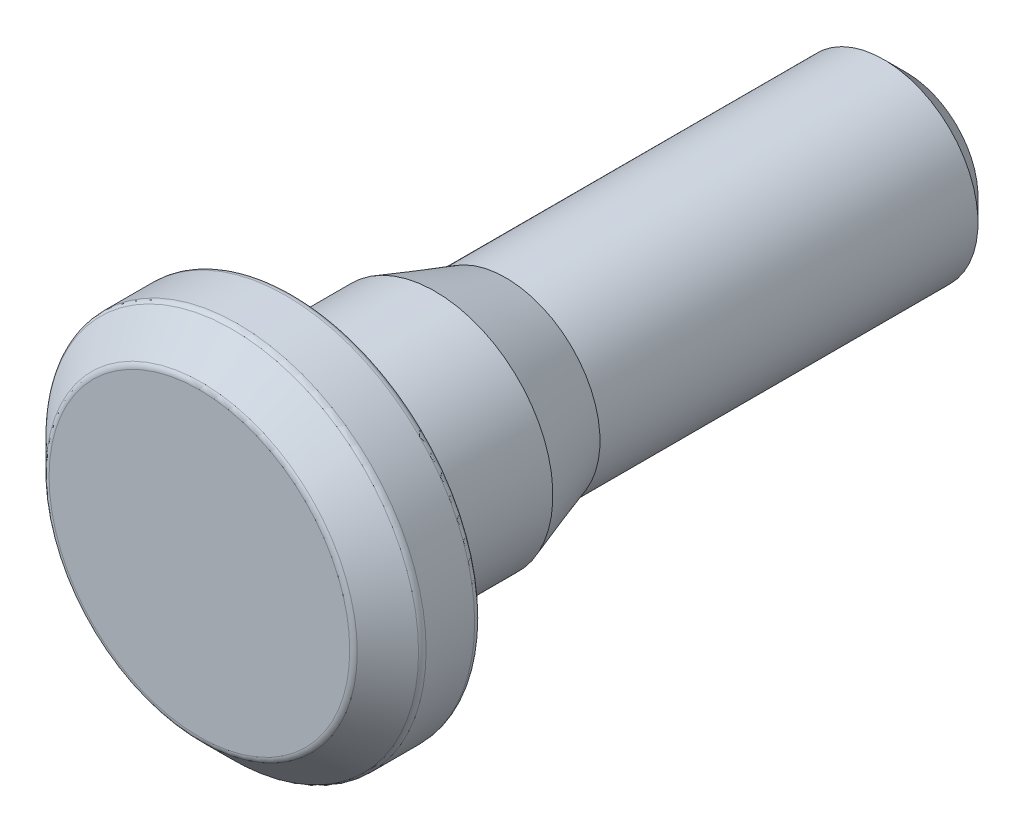
ISO-10303-21;
HEADER;
FILE_DESCRIPTION(('STEP AP214'),'2;1');
FILE_NAME('part.step','',(''),(''),'','','');
FILE_SCHEMA(('AUTOMOTIVE_DESIGN { 1 0 10303 214 1 1 1 1 }'));
ENDSEC;
DATA;
#1=APPLICATION_CONTEXT('core data for automotive mechanical design processes');
#2=APPLICATION_PROTOCOL_DEFINITION('international standard','automotive_design',2000,#1);
#3=PRODUCT_CONTEXT('',#1,'mechanical');
#4=PRODUCT('Part','Part','',(#3));
#5=PRODUCT_RELATED_PRODUCT_CATEGORY('part','',(#4));
#6=PRODUCT_DEFINITION_FORMATION('','',#4);
#7=PRODUCT_DEFINITION_CONTEXT('part definition',#1,'design');
#8=PRODUCT_DEFINITION('design','',#6,#7);
#9=PRODUCT_DEFINITION_SHAPE('','',#8);
#10=(LENGTH_UNIT() NAMED_UNIT(*) SI_UNIT(.MILLI.,.METRE.));
#11=(NAMED_UNIT(*) PLANE_ANGLE_UNIT() SI_UNIT($,.RADIAN.));
#12=(NAMED_UNIT(*) SI_UNIT($,.STERADIAN.) SOLID_ANGLE_UNIT());
#13=UNCERTAINTY_MEASURE_WITH_UNIT(LENGTH_MEASURE(1.E-05),#10,'distance_accuracy_value','');
#14=(GEOMETRIC_REPRESENTATION_CONTEXT(3) GLOBAL_UNCERTAINTY_ASSIGNED_CONTEXT((#13)) GLOBAL_UNIT_ASSIGNED_CONTEXT((#10,
#11,#12)) REPRESENTATION_CONTEXT('',''));
#15=CARTESIAN_POINT('',(0.,0.,0.));
#16=DIRECTION('',(0.,0.,1.));
#17=DIRECTION('',(1.,0.,0.));
#18=AXIS2_PLACEMENT_3D('',#15,#16,#17);
#19=CARTESIAN_POINT('',(0.,0.,-41.275));
#20=DIRECTION('',(0.,0.,-1.));
#21=DIRECTION('',(-1.,0.,0.));
#22=AXIS2_PLACEMENT_3D('',#19,#20,#21);
#23=PLANE('',#22);
#24=CARTESIAN_POINT('',(0.,0.,-41.275));
#25=DIRECTION('',(0.,0.,-1.));
#26=DIRECTION('',(-1.,0.,0.));
#27=AXIS2_PLACEMENT_3D('',#24,#25,#26);
#28=CIRCLE('',#27,4.826);
#29=CARTESIAN_POINT('',(-4.826,0.,-41.275));
#30=VERTEX_POINT('',#29);
#31=EDGE_CURVE('E65',#30,#30,#28,.T.);
#32=ORIENTED_EDGE('',*,*,#31,.T.);
#33=EDGE_LOOP('',(#32));
#34=FACE_BOUND('',#33,.T.);
#35=ADVANCED_FACE('F34',(#34),#23,.T.);
#36=CARTESIAN_POINT('',(0.,0.,-41.275));
#37=DIRECTION('',(0.,0.,1.));
#38=DIRECTION('',(1.,0.,0.));
#39=AXIS2_PLACEMENT_3D('',#36,#37,#38);
#40=CONICAL_SURFACE('',#39,4.826,0.785398163397452);
#41=CARTESIAN_POINT('',(0.,0.,-39.751));
#42=DIRECTION('',(0.,0.,-1.));
#43=DIRECTION('',(-1.,0.,0.));
#44=AXIS2_PLACEMENT_3D('',#41,#42,#43);
#45=CIRCLE('',#44,6.35);
#46=CARTESIAN_POINT('',(-6.35,0.,-39.751));
#47=VERTEX_POINT('',#46);
#48=EDGE_CURVE('E68',#47,#47,#45,.T.);
#49=ORIENTED_EDGE('',*,*,#48,.T.);
#50=EDGE_LOOP('',(#49));
#51=FACE_BOUND('',#50,.T.);
#52=ORIENTED_EDGE('',*,*,#31,.F.);
#53=EDGE_LOOP('',(#52));
#54=FACE_BOUND('',#53,.T.);
#55=ADVANCED_FACE('F96',(#51,#54),#40,.T.);
#56=CARTESIAN_POINT('',(0.,0.,0.));
#57=DIRECTION('',(0.,0.,-1.));
#58=DIRECTION('',(-1.,0.,0.));
#59=AXIS2_PLACEMENT_3D('',#56,#57,#58);
#60=CYLINDRICAL_SURFACE('',#59,6.35);
#61=CARTESIAN_POINT('',(0.,0.,-14.2875));
#62=DIRECTION('',(0.,0.,-1.));
#63=DIRECTION('',(-1.,0.,0.));
#64=AXIS2_PLACEMENT_3D('',#61,#62,#63);
#65=CIRCLE('',#64,6.35);
#66=CARTESIAN_POINT('',(-6.35,0.,-14.2875));
#67=VERTEX_POINT('',#66);
#68=EDGE_CURVE('E71',#67,#67,#65,.T.);
#69=ORIENTED_EDGE('',*,*,#68,.T.);
#70=EDGE_LOOP('',(#69));
#71=FACE_BOUND('',#70,.T.);
#72=ORIENTED_EDGE('',*,*,#48,.F.);
#73=EDGE_LOOP('',(#72));
#74=FACE_BOUND('',#73,.T.);
#75=ADVANCED_FACE('F93',(#71,#74),#60,.T.);
#76=CARTESIAN_POINT('',(0.,0.,-14.2875));
#77=DIRECTION('',(0.,0.,1.));
#78=DIRECTION('',(1.,0.,0.));
#79=AXIS2_PLACEMENT_3D('',#76,#77,#78);
#80=CONICAL_SURFACE('',#79,6.35,0.321750554396642);
#81=CARTESIAN_POINT('',(0.,0.,-9.525));
#82=DIRECTION('',(0.,0.,-1.));
#83=DIRECTION('',(-1.,0.,0.));
#84=AXIS2_PLACEMENT_3D('',#81,#82,#83);
#85=CIRCLE('',#84,7.9375);
#86=CARTESIAN_POINT('',(-7.9375,0.,-9.525));
#87=VERTEX_POINT('',#86);
#88=EDGE_CURVE('E74',#87,#87,#85,.T.);
#89=ORIENTED_EDGE('',*,*,#88,.T.);
#90=EDGE_LOOP('',(#89));
#91=FACE_BOUND('',#90,.T.);
#92=ORIENTED_EDGE('',*,*,#68,.F.);
#93=EDGE_LOOP('',(#92));
#94=FACE_BOUND('',#93,.T.);
#95=ADVANCED_FACE('F78',(#91,#94),#80,.T.);
#96=CARTESIAN_POINT('',(0.,0.,0.));
#97=DIRECTION('',(0.,0.,-1.));
#98=DIRECTION('',(-1.,0.,0.));
#99=AXIS2_PLACEMENT_3D('',#96,#97,#98);
#100=CYLINDRICAL_SURFACE('',#99,7.9375);
#101=CARTESIAN_POINT('',(0.,0.,-0.508));
#102=DIRECTION('',(0.,0.,-1.));
#103=DIRECTION('',(-1.,0.,0.));
#104=AXIS2_PLACEMENT_3D('',#101,#102,#103);
#105=CIRCLE('',#104,7.9375);
#106=CARTESIAN_POINT('',(-7.9375,0.,-0.508));
#107=VERTEX_POINT('',#106);
#108=EDGE_CURVE('E62',#107,#107,#105,.T.);
#109=ORIENTED_EDGE('',*,*,#108,.T.);
#110=EDGE_LOOP('',(#109));
#111=FACE_BOUND('',#110,.T.);
#112=ORIENTED_EDGE('',*,*,#88,.F.);
#113=EDGE_LOOP('',(#112));
#114=FACE_BOUND('',#113,.T.);
#115=ADVANCED_FACE('F81',(#111,#114),#100,.T.);
#116=CARTESIAN_POINT('',(0.,7.9375,0.));
#117=DIRECTION('',(0.,0.,-1.));
#118=DIRECTION('',(-1.,0.,0.));
#119=AXIS2_PLACEMENT_3D('',#116,#117,#118);
#120=PLANE('',#119);
#121=CARTESIAN_POINT('',(0.,0.,0.));
#122=DIRECTION('',(0.,0.,-1.));
#123=DIRECTION('',(-1.,0.,0.));
#124=AXIS2_PLACEMENT_3D('',#121,#122,#123);
#125=CIRCLE('',#124,8.4455);
#126=CARTESIAN_POINT('',(-8.4455,0.,0.));
#127=VERTEX_POINT('',#126);
#128=EDGE_CURVE('E56',#127,#127,#125,.F.);
#129=ORIENTED_EDGE('',*,*,#128,.T.);
#130=EDGE_LOOP('',(#129));
#131=FACE_BOUND('',#130,.T.);
#132=CARTESIAN_POINT('',(0.,0.,0.));
#133=DIRECTION('',(0.,0.,-1.));
#134=DIRECTION('',(-1.,0.,0.));
#135=AXIS2_PLACEMENT_3D('',#132,#133,#134);
#136=CIRCLE('',#135,12.192);
#137=CARTESIAN_POINT('',(-12.192,0.,0.));
#138=VERTEX_POINT('',#137);
#139=EDGE_CURVE('E59',#138,#138,#136,.T.);
#140=ORIENTED_EDGE('',*,*,#139,.T.);
#141=EDGE_LOOP('',(#140));
#142=FACE_BOUND('',#141,.T.);
#143=ADVANCED_FACE('F83',(#131,#142),#120,.T.);
#144=CARTESIAN_POINT('',(0.,0.,0.));
#145=DIRECTION('',(0.,0.,-1.));
#146=DIRECTION('',(-1.,0.,0.));
#147=AXIS2_PLACEMENT_3D('',#144,#145,#146);
#148=CYLINDRICAL_SURFACE('',#147,12.7);
#149=CARTESIAN_POINT('',(0.,0.,0.508));
#150=DIRECTION('',(0.,0.,-1.));
#151=DIRECTION('',(-1.,0.,0.));
#152=AXIS2_PLACEMENT_3D('',#149,#150,#151);
#153=CIRCLE('',#152,12.7);
#154=CARTESIAN_POINT('',(-12.7,0.,0.508));
#155=VERTEX_POINT('',#154);
#156=EDGE_CURVE('E48',#155,#155,#153,.F.);
#157=ORIENTED_EDGE('',*,*,#156,.T.);
#158=EDGE_LOOP('',(#157));
#159=FACE_BOUND('',#158,.T.);
#160=CARTESIAN_POINT('',(0.,0.,3.77737951031447));
#161=DIRECTION('',(0.,0.,1.));
#162=DIRECTION('',(1.,0.,0.));
#163=AXIS2_PLACEMENT_3D('',#160,#161,#162);
#164=CIRCLE('',#163,12.7);
#165=CARTESIAN_POINT('',(12.7,0.,3.77737951031447));
#166=VERTEX_POINT('',#165);
#167=EDGE_CURVE('E53',#166,#166,#164,.F.);
#168=ORIENTED_EDGE('',*,*,#167,.T.);
#169=EDGE_LOOP('',(#168));
#170=FACE_BOUND('',#169,.T.);
#171=ADVANCED_FACE('F90',(#159,#170),#148,.T.);
#172=CARTESIAN_POINT('',(0.,0.,3.9878));
#173=DIRECTION('',(0.,0.,-1.));
#174=DIRECTION('',(-1.,0.,0.));
#175=AXIS2_PLACEMENT_3D('',#172,#173,#174);
#176=CONICAL_SURFACE('',#175,12.7,0.78539816339745);
#177=CARTESIAN_POINT('',(0.,0.,4.13658975515723));
#178=DIRECTION('',(0.,0.,1.));
#179=DIRECTION('',(1.,0.,0.));
#180=AXIS2_PLACEMENT_3D('',#177,#178,#179);
#181=CIRCLE('',#180,12.5512102448428);
#182=CARTESIAN_POINT('',(12.5512102448428,0.,4.13658975515723));
#183=VERTEX_POINT('',#182);
#184=EDGE_CURVE('E40',#183,#183,#181,.T.);
#185=ORIENTED_EDGE('',*,*,#184,.T.);
#186=EDGE_LOOP('',(#185));
#187=FACE_BOUND('',#186,.T.);
#188=CARTESIAN_POINT('',(0.,0.,6.20121024484277));
#189=DIRECTION('',(0.,0.,1.));
#190=DIRECTION('',(1.,0.,0.));
#191=AXIS2_PLACEMENT_3D('',#188,#189,#190);
#192=CIRCLE('',#191,10.4865897551572);
#193=CARTESIAN_POINT('',(10.4865897551572,0.,6.20121024484277));
#194=VERTEX_POINT('',#193);
#195=EDGE_CURVE('E44',#194,#194,#192,.F.);
#196=ORIENTED_EDGE('',*,*,#195,.T.);
#197=EDGE_LOOP('',(#196));
#198=FACE_BOUND('',#197,.T.);
#199=ADVANCED_FACE('F137',(#187,#198),#176,.T.);
#200=CARTESIAN_POINT('',(0.,10.3378,6.35));
#201=DIRECTION('',(0.,0.,1.));
#202=DIRECTION('',(1.,0.,0.));
#203=AXIS2_PLACEMENT_3D('',#200,#201,#202);
#204=PLANE('',#203);
#205=CARTESIAN_POINT('',(0.,0.,6.35));
#206=DIRECTION('',(0.,0.,1.));
#207=DIRECTION('',(1.,0.,0.));
#208=AXIS2_PLACEMENT_3D('',#205,#206,#207);
#209=CIRCLE('',#208,10.1273795103145);
#210=CARTESIAN_POINT('',(10.1273795103145,0.,6.35));
#211=VERTEX_POINT('',#210);
#212=EDGE_CURVE('E10',#211,#211,#209,.T.);
#213=ORIENTED_EDGE('',*,*,#212,.T.);
#214=EDGE_LOOP('',(#213));
#215=FACE_BOUND('',#214,.T.);
#216=ADVANCED_FACE('F147',(#215),#204,.T.);
#217=CARTESIAN_POINT('',(0.,0.,-0.508));
#218=DIRECTION('',(0.,0.,-1.));
#219=DIRECTION('',(-1.,0.,0.));
#220=AXIS2_PLACEMENT_3D('',#217,#218,#219);
#221=TOROIDAL_SURFACE('',#220,8.4455,0.508);
#222=ORIENTED_EDGE('',*,*,#128,.F.);
#223=EDGE_LOOP('',(#222));
#224=FACE_BOUND('',#223,.T.);
#225=ORIENTED_EDGE('',*,*,#108,.F.);
#226=EDGE_LOOP('',(#225));
#227=FACE_BOUND('',#226,.T.);
#228=ADVANCED_FACE('F156',(#224,#227),#221,.F.);
#229=CARTESIAN_POINT('',(0.,0.,0.508));
#230=DIRECTION('',(0.,0.,-1.));
#231=DIRECTION('',(-1.,0.,0.));
#232=AXIS2_PLACEMENT_3D('',#229,#230,#231);
#233=TOROIDAL_SURFACE('',#232,12.192,0.508);
#234=ORIENTED_EDGE('',*,*,#156,.F.);
#235=EDGE_LOOP('',(#234));
#236=FACE_BOUND('',#235,.T.);
#237=ORIENTED_EDGE('',*,*,#139,.F.);
#238=EDGE_LOOP('',(#237));
#239=FACE_BOUND('',#238,.T.);
#240=ADVANCED_FACE('F165',(#236,#239),#233,.T.);
#241=CARTESIAN_POINT('',(0.,0.,3.77737951031447));
#242=DIRECTION('',(0.,0.,1.));
#243=DIRECTION('',(1.,0.,0.));
#244=AXIS2_PLACEMENT_3D('',#241,#242,#243);
#245=TOROIDAL_SURFACE('',#244,12.192,0.508);
#246=ORIENTED_EDGE('',*,*,#184,.F.);
#247=EDGE_LOOP('',(#246));
#248=FACE_BOUND('',#247,.T.);
#249=ORIENTED_EDGE('',*,*,#167,.F.);
#250=EDGE_LOOP('',(#249));
#251=FACE_BOUND('',#250,.T.);
#252=ADVANCED_FACE('F175',(#248,#251),#245,.T.);
#253=CARTESIAN_POINT('',(0.,0.,5.842));
#254=DIRECTION('',(0.,0.,1.));
#255=DIRECTION('',(1.,0.,0.));
#256=AXIS2_PLACEMENT_3D('',#253,#254,#255);
#257=TOROIDAL_SURFACE('',#256,10.1273795103145,0.508);
#258=ORIENTED_EDGE('',*,*,#212,.F.);
#259=EDGE_LOOP('',(#258));
#260=FACE_BOUND('',#259,.T.);
#261=ORIENTED_EDGE('',*,*,#195,.F.);
#262=EDGE_LOOP('',(#261));
#263=FACE_BOUND('',#262,.T.);
#264=ADVANCED_FACE('F185',(#260,#263),#257,.T.);
#265=CLOSED_SHELL('',(#35,#55,#75,#95,#115,#143,#171,#199,#216,#228,#240,#252,#264));
#266=MANIFOLD_SOLID_BREP('B2',#265);
#267=ADVANCED_BREP_SHAPE_REPRESENTATION('',(#18,#266),#14);
#268=SHAPE_DEFINITION_REPRESENTATION(#9,#267);
ENDSEC;
END-ISO-10303-21;
